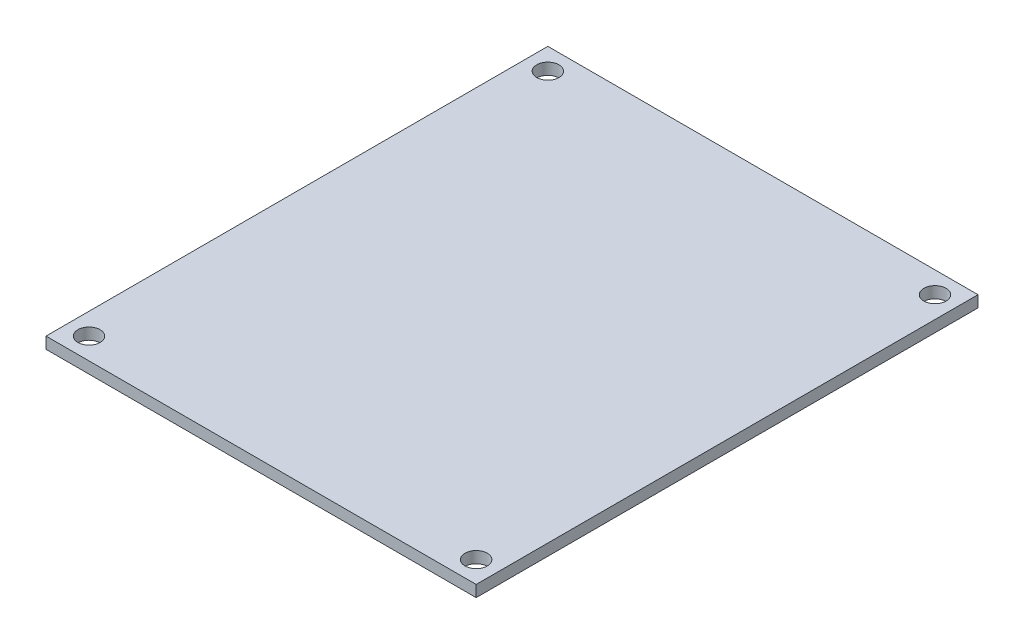
ISO-10303-21;
HEADER;
FILE_DESCRIPTION(('STEP AP214'),'2;1');
FILE_NAME('part.step','',(''),(''),'','','');
FILE_SCHEMA(('AUTOMOTIVE_DESIGN { 1 0 10303 214 1 1 1 1 }'));
ENDSEC;
DATA;
#1=APPLICATION_CONTEXT('core data for automotive mechanical design processes');
#2=APPLICATION_PROTOCOL_DEFINITION('international standard','automotive_design',2000,#1);
#3=PRODUCT_CONTEXT('',#1,'mechanical');
#4=PRODUCT('Part','Part','',(#3));
#5=PRODUCT_RELATED_PRODUCT_CATEGORY('part','',(#4));
#6=PRODUCT_DEFINITION_FORMATION('','',#4);
#7=PRODUCT_DEFINITION_CONTEXT('part definition',#1,'design');
#8=PRODUCT_DEFINITION('design','',#6,#7);
#9=PRODUCT_DEFINITION_SHAPE('','',#8);
#10=(LENGTH_UNIT() NAMED_UNIT(*) SI_UNIT(.MILLI.,.METRE.));
#11=(NAMED_UNIT(*) PLANE_ANGLE_UNIT() SI_UNIT($,.RADIAN.));
#12=(NAMED_UNIT(*) SI_UNIT($,.STERADIAN.) SOLID_ANGLE_UNIT());
#13=UNCERTAINTY_MEASURE_WITH_UNIT(LENGTH_MEASURE(1.E-05),#10,'distance_accuracy_value','');
#14=(GEOMETRIC_REPRESENTATION_CONTEXT(3) GLOBAL_UNCERTAINTY_ASSIGNED_CONTEXT((#13)) GLOBAL_UNIT_ASSIGNED_CONTEXT((#10,
#11,#12)) REPRESENTATION_CONTEXT('',''));
#15=CARTESIAN_POINT('',(0.,0.,0.));
#16=DIRECTION('',(0.,0.,1.));
#17=DIRECTION('',(1.,0.,0.));
#18=AXIS2_PLACEMENT_3D('',#15,#16,#17);
#19=CARTESIAN_POINT('',(0.,1.6,0.));
#20=DIRECTION('',(0.,1.,0.));
#21=DIRECTION('',(0.,0.,1.));
#22=AXIS2_PLACEMENT_3D('',#19,#20,#21);
#23=PLANE('',#22);
#24=CARTESIAN_POINT('',(27.,1.6,32.));
#25=DIRECTION('',(0.,1.,0.));
#26=DIRECTION('',(0.,0.,1.));
#27=AXIS2_PLACEMENT_3D('',#24,#25,#26);
#28=CIRCLE('',#27,1.55);
#29=CARTESIAN_POINT('',(27.,1.6,33.55));
#30=VERTEX_POINT('',#29);
#31=EDGE_CURVE('E142',#30,#30,#28,.T.);
#32=ORIENTED_EDGE('',*,*,#31,.F.);
#33=EDGE_LOOP('',(#32));
#34=FACE_BOUND('',#33,.T.);
#35=CARTESIAN_POINT('',(27.,1.6,-32.));
#36=DIRECTION('',(0.,1.,0.));
#37=DIRECTION('',(0.,0.,1.));
#38=AXIS2_PLACEMENT_3D('',#35,#36,#37);
#39=CIRCLE('',#38,1.55);
#40=CARTESIAN_POINT('',(27.,1.6,-30.45));
#41=VERTEX_POINT('',#40);
#42=EDGE_CURVE('E112',#41,#41,#39,.T.);
#43=ORIENTED_EDGE('',*,*,#42,.F.);
#44=EDGE_LOOP('',(#43));
#45=FACE_BOUND('',#44,.T.);
#46=DIRECTION('',(0.,0.,-1.));
#47=VECTOR('',#46,1.);
#48=CARTESIAN_POINT('',(30.,1.6,-35.));
#49=LINE('',#48,#47);
#50=CARTESIAN_POINT('',(30.,1.6,35.));
#51=VERTEX_POINT('',#50);
#52=CARTESIAN_POINT('',(30.,1.6,-35.));
#53=VERTEX_POINT('',#52);
#54=EDGE_CURVE('E92',#51,#53,#49,.T.);
#55=ORIENTED_EDGE('',*,*,#54,.T.);
#56=DIRECTION('',(-1.,0.,0.));
#57=VECTOR('',#56,1.);
#58=CARTESIAN_POINT('',(-30.,1.6,-35.));
#59=LINE('',#58,#57);
#60=CARTESIAN_POINT('',(-30.,1.6,-35.));
#61=VERTEX_POINT('',#60);
#62=EDGE_CURVE('E87',#53,#61,#59,.T.);
#63=ORIENTED_EDGE('',*,*,#62,.T.);
#64=DIRECTION('',(0.,0.,1.));
#65=VECTOR('',#64,1.);
#66=CARTESIAN_POINT('',(-30.,1.6,-35.));
#67=LINE('',#66,#65);
#68=CARTESIAN_POINT('',(-30.,1.6,35.));
#69=VERTEX_POINT('',#68);
#70=EDGE_CURVE('E90',#61,#69,#67,.T.);
#71=ORIENTED_EDGE('',*,*,#70,.T.);
#72=DIRECTION('',(1.,0.,0.));
#73=VECTOR('',#72,1.);
#74=CARTESIAN_POINT('',(-30.,1.6,35.));
#75=LINE('',#74,#73);
#76=EDGE_CURVE('E57',#69,#51,#75,.T.);
#77=ORIENTED_EDGE('',*,*,#76,.T.);
#78=EDGE_LOOP('',(#55,#63,#71,#77));
#79=FACE_BOUND('',#78,.T.);
#80=CARTESIAN_POINT('',(-27.,1.6,-32.));
#81=DIRECTION('',(0.,1.,0.));
#82=DIRECTION('',(0.,0.,1.));
#83=AXIS2_PLACEMENT_3D('',#80,#81,#82);
#84=CIRCLE('',#83,1.55);
#85=CARTESIAN_POINT('',(-27.,1.6,-30.45));
#86=VERTEX_POINT('',#85);
#87=EDGE_CURVE('E134',#86,#86,#84,.T.);
#88=ORIENTED_EDGE('',*,*,#87,.F.);
#89=EDGE_LOOP('',(#88));
#90=FACE_BOUND('',#89,.T.);
#91=CARTESIAN_POINT('',(-27.,1.6,32.));
#92=DIRECTION('',(0.,1.,0.));
#93=DIRECTION('',(0.,0.,1.));
#94=AXIS2_PLACEMENT_3D('',#91,#92,#93);
#95=CIRCLE('',#94,1.55);
#96=CARTESIAN_POINT('',(-27.,1.6,33.55));
#97=VERTEX_POINT('',#96);
#98=EDGE_CURVE('E150',#97,#97,#95,.T.);
#99=ORIENTED_EDGE('',*,*,#98,.F.);
#100=EDGE_LOOP('',(#99));
#101=FACE_BOUND('',#100,.T.);
#102=ADVANCED_FACE('F39',(#34,#45,#79,#90,#101),#23,.T.);
#103=CARTESIAN_POINT('',(0.,0.,0.));
#104=DIRECTION('',(0.,1.,0.));
#105=DIRECTION('',(0.,0.,1.));
#106=AXIS2_PLACEMENT_3D('',#103,#104,#105);
#107=PLANE('',#106);
#108=DIRECTION('',(0.,0.,-1.));
#109=VECTOR('',#108,1.);
#110=CARTESIAN_POINT('',(30.,0.,-35.));
#111=LINE('',#110,#109);
#112=CARTESIAN_POINT('',(30.,0.,35.));
#113=VERTEX_POINT('',#112);
#114=CARTESIAN_POINT('',(30.,0.,-35.));
#115=VERTEX_POINT('',#114);
#116=EDGE_CURVE('E108',#113,#115,#111,.T.);
#117=ORIENTED_EDGE('',*,*,#116,.F.);
#118=DIRECTION('',(1.,0.,0.));
#119=VECTOR('',#118,1.);
#120=CARTESIAN_POINT('',(-30.,0.,35.));
#121=LINE('',#120,#119);
#122=CARTESIAN_POINT('',(-30.,0.,35.));
#123=VERTEX_POINT('',#122);
#124=EDGE_CURVE('E80',#123,#113,#121,.T.);
#125=ORIENTED_EDGE('',*,*,#124,.F.);
#126=DIRECTION('',(0.,0.,1.));
#127=VECTOR('',#126,1.);
#128=CARTESIAN_POINT('',(-30.,0.,-35.));
#129=LINE('',#128,#127);
#130=CARTESIAN_POINT('',(-30.,0.,-35.));
#131=VERTEX_POINT('',#130);
#132=EDGE_CURVE('E74',#131,#123,#129,.T.);
#133=ORIENTED_EDGE('',*,*,#132,.F.);
#134=DIRECTION('',(-1.,0.,0.));
#135=VECTOR('',#134,1.);
#136=CARTESIAN_POINT('',(-30.,0.,-35.));
#137=LINE('',#136,#135);
#138=EDGE_CURVE('E97',#115,#131,#137,.T.);
#139=ORIENTED_EDGE('',*,*,#138,.F.);
#140=EDGE_LOOP('',(#117,#125,#133,#139));
#141=FACE_BOUND('',#140,.T.);
#142=CARTESIAN_POINT('',(27.,0.,-32.));
#143=DIRECTION('',(0.,1.,0.));
#144=DIRECTION('',(0.,0.,1.));
#145=AXIS2_PLACEMENT_3D('',#142,#143,#144);
#146=CIRCLE('',#145,1.55);
#147=CARTESIAN_POINT('',(27.,0.,-30.45));
#148=VERTEX_POINT('',#147);
#149=EDGE_CURVE('E130',#148,#148,#146,.T.);
#150=ORIENTED_EDGE('',*,*,#149,.T.);
#151=EDGE_LOOP('',(#150));
#152=FACE_BOUND('',#151,.T.);
#153=CARTESIAN_POINT('',(-27.,0.,-32.));
#154=DIRECTION('',(0.,1.,0.));
#155=DIRECTION('',(0.,0.,1.));
#156=AXIS2_PLACEMENT_3D('',#153,#154,#155);
#157=CIRCLE('',#156,1.55);
#158=CARTESIAN_POINT('',(-27.,0.,-30.45));
#159=VERTEX_POINT('',#158);
#160=EDGE_CURVE('E138',#159,#159,#157,.T.);
#161=ORIENTED_EDGE('',*,*,#160,.T.);
#162=EDGE_LOOP('',(#161));
#163=FACE_BOUND('',#162,.T.);
#164=CARTESIAN_POINT('',(27.,0.,32.));
#165=DIRECTION('',(0.,1.,0.));
#166=DIRECTION('',(0.,0.,1.));
#167=AXIS2_PLACEMENT_3D('',#164,#165,#166);
#168=CIRCLE('',#167,1.55);
#169=CARTESIAN_POINT('',(27.,0.,33.55));
#170=VERTEX_POINT('',#169);
#171=EDGE_CURVE('E146',#170,#170,#168,.T.);
#172=ORIENTED_EDGE('',*,*,#171,.T.);
#173=EDGE_LOOP('',(#172));
#174=FACE_BOUND('',#173,.T.);
#175=CARTESIAN_POINT('',(-27.,0.,32.));
#176=DIRECTION('',(0.,1.,0.));
#177=DIRECTION('',(0.,0.,1.));
#178=AXIS2_PLACEMENT_3D('',#175,#176,#177);
#179=CIRCLE('',#178,1.55);
#180=CARTESIAN_POINT('',(-27.,0.,33.55));
#181=VERTEX_POINT('',#180);
#182=EDGE_CURVE('E154',#181,#181,#179,.T.);
#183=ORIENTED_EDGE('',*,*,#182,.T.);
#184=EDGE_LOOP('',(#183));
#185=FACE_BOUND('',#184,.T.);
#186=ADVANCED_FACE('F125',(#141,#152,#163,#174,#185),#107,.F.);
#187=CARTESIAN_POINT('',(30.,1.6,-35.));
#188=DIRECTION('',(-1.,0.,0.));
#189=DIRECTION('',(0.,0.,1.));
#190=AXIS2_PLACEMENT_3D('',#187,#188,#189);
#191=PLANE('',#190);
#192=ORIENTED_EDGE('',*,*,#116,.T.);
#193=DIRECTION('',(0.,-1.,0.));
#194=VECTOR('',#193,1.);
#195=CARTESIAN_POINT('',(30.,1.6,-35.));
#196=LINE('',#195,#194);
#197=EDGE_CURVE('E11',#53,#115,#196,.T.);
#198=ORIENTED_EDGE('',*,*,#197,.F.);
#199=ORIENTED_EDGE('',*,*,#54,.F.);
#200=DIRECTION('',(0.,-1.,0.));
#201=VECTOR('',#200,1.);
#202=CARTESIAN_POINT('',(30.,1.6,35.));
#203=LINE('',#202,#201);
#204=EDGE_CURVE('E104',#51,#113,#203,.T.);
#205=ORIENTED_EDGE('',*,*,#204,.T.);
#206=EDGE_LOOP('',(#192,#198,#199,#205));
#207=FACE_BOUND('',#206,.T.);
#208=ADVANCED_FACE('F41',(#207),#191,.F.);
#209=CARTESIAN_POINT('',(-30.,1.6,-35.));
#210=DIRECTION('',(0.,0.,1.));
#211=DIRECTION('',(1.,0.,0.));
#212=AXIS2_PLACEMENT_3D('',#209,#210,#211);
#213=PLANE('',#212);
#214=ORIENTED_EDGE('',*,*,#138,.T.);
#215=DIRECTION('',(0.,-1.,0.));
#216=VECTOR('',#215,1.);
#217=CARTESIAN_POINT('',(-30.,1.6,-35.));
#218=LINE('',#217,#216);
#219=EDGE_CURVE('E49',#61,#131,#218,.T.);
#220=ORIENTED_EDGE('',*,*,#219,.F.);
#221=ORIENTED_EDGE('',*,*,#62,.F.);
#222=ORIENTED_EDGE('',*,*,#197,.T.);
#223=EDGE_LOOP('',(#214,#220,#221,#222));
#224=FACE_BOUND('',#223,.T.);
#225=ADVANCED_FACE('F96',(#224),#213,.F.);
#226=CARTESIAN_POINT('',(-30.,1.6,-35.));
#227=DIRECTION('',(1.,0.,0.));
#228=DIRECTION('',(0.,0.,-1.));
#229=AXIS2_PLACEMENT_3D('',#226,#227,#228);
#230=PLANE('',#229);
#231=ORIENTED_EDGE('',*,*,#132,.T.);
#232=DIRECTION('',(0.,-1.,0.));
#233=VECTOR('',#232,1.);
#234=CARTESIAN_POINT('',(-30.,1.6,35.));
#235=LINE('',#234,#233);
#236=EDGE_CURVE('E99',#69,#123,#235,.T.);
#237=ORIENTED_EDGE('',*,*,#236,.F.);
#238=ORIENTED_EDGE('',*,*,#70,.F.);
#239=ORIENTED_EDGE('',*,*,#219,.T.);
#240=EDGE_LOOP('',(#231,#237,#238,#239));
#241=FACE_BOUND('',#240,.T.);
#242=ADVANCED_FACE('F100',(#241),#230,.F.);
#243=CARTESIAN_POINT('',(-30.,1.6,35.));
#244=DIRECTION('',(0.,0.,-1.));
#245=DIRECTION('',(-1.,0.,0.));
#246=AXIS2_PLACEMENT_3D('',#243,#244,#245);
#247=PLANE('',#246);
#248=ORIENTED_EDGE('',*,*,#124,.T.);
#249=ORIENTED_EDGE('',*,*,#204,.F.);
#250=ORIENTED_EDGE('',*,*,#76,.F.);
#251=ORIENTED_EDGE('',*,*,#236,.T.);
#252=EDGE_LOOP('',(#248,#249,#250,#251));
#253=FACE_BOUND('',#252,.T.);
#254=ADVANCED_FACE('F122',(#253),#247,.F.);
#255=CARTESIAN_POINT('',(27.,1.6,-32.));
#256=DIRECTION('',(0.,-1.,0.));
#257=DIRECTION('',(0.,0.,-1.));
#258=AXIS2_PLACEMENT_3D('',#255,#256,#257);
#259=CYLINDRICAL_SURFACE('',#258,1.55);
#260=ORIENTED_EDGE('',*,*,#42,.T.);
#261=EDGE_LOOP('',(#260));
#262=FACE_BOUND('',#261,.T.);
#263=ORIENTED_EDGE('',*,*,#149,.F.);
#264=EDGE_LOOP('',(#263));
#265=FACE_BOUND('',#264,.T.);
#266=ADVANCED_FACE('F175',(#262,#265),#259,.F.);
#267=CARTESIAN_POINT('',(-27.,1.6,-32.));
#268=DIRECTION('',(0.,-1.,0.));
#269=DIRECTION('',(0.,0.,-1.));
#270=AXIS2_PLACEMENT_3D('',#267,#268,#269);
#271=CYLINDRICAL_SURFACE('',#270,1.55);
#272=ORIENTED_EDGE('',*,*,#87,.T.);
#273=EDGE_LOOP('',(#272));
#274=FACE_BOUND('',#273,.T.);
#275=ORIENTED_EDGE('',*,*,#160,.F.);
#276=EDGE_LOOP('',(#275));
#277=FACE_BOUND('',#276,.T.);
#278=ADVANCED_FACE('F221',(#274,#277),#271,.F.);
#279=CARTESIAN_POINT('',(27.,1.6,32.));
#280=DIRECTION('',(0.,-1.,0.));
#281=DIRECTION('',(0.,0.,-1.));
#282=AXIS2_PLACEMENT_3D('',#279,#280,#281);
#283=CYLINDRICAL_SURFACE('',#282,1.55);
#284=ORIENTED_EDGE('',*,*,#31,.T.);
#285=EDGE_LOOP('',(#284));
#286=FACE_BOUND('',#285,.T.);
#287=ORIENTED_EDGE('',*,*,#171,.F.);
#288=EDGE_LOOP('',(#287));
#289=FACE_BOUND('',#288,.T.);
#290=ADVANCED_FACE('F229',(#286,#289),#283,.F.);
#291=CARTESIAN_POINT('',(-27.,1.6,32.));
#292=DIRECTION('',(0.,-1.,0.));
#293=DIRECTION('',(0.,0.,-1.));
#294=AXIS2_PLACEMENT_3D('',#291,#292,#293);
#295=CYLINDRICAL_SURFACE('',#294,1.55);
#296=ORIENTED_EDGE('',*,*,#98,.T.);
#297=EDGE_LOOP('',(#296));
#298=FACE_BOUND('',#297,.T.);
#299=ORIENTED_EDGE('',*,*,#182,.F.);
#300=EDGE_LOOP('',(#299));
#301=FACE_BOUND('',#300,.T.);
#302=ADVANCED_FACE('F162',(#298,#301),#295,.F.);
#303=CLOSED_SHELL('',(#102,#186,#208,#225,#242,#254,#266,#278,#290,#302));
#304=MANIFOLD_SOLID_BREP('B2',#303);
#305=ADVANCED_BREP_SHAPE_REPRESENTATION('',(#18,#304),#14);
#306=SHAPE_DEFINITION_REPRESENTATION(#9,#305);
ENDSEC;
END-ISO-10303-21;
